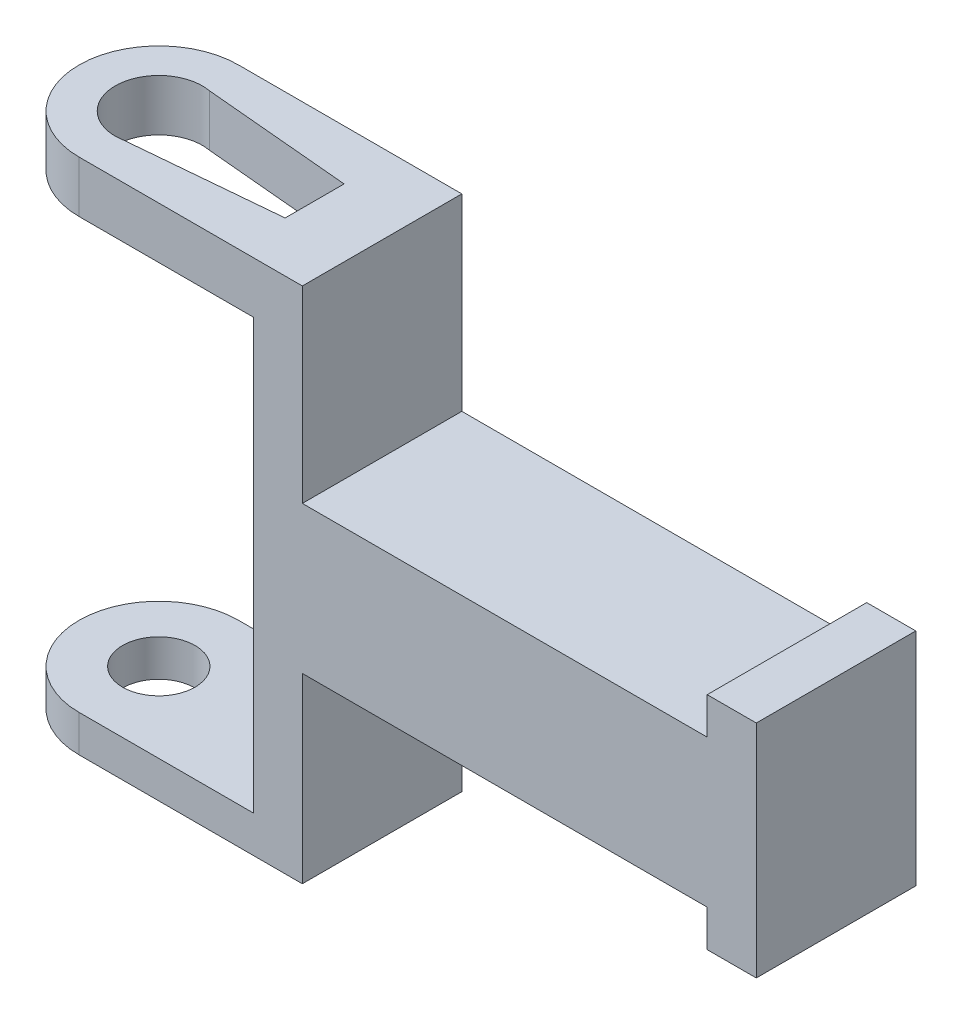
ISO-10303-21;
HEADER;
FILE_DESCRIPTION(('STEP AP214'),'2;1');
FILE_NAME('part.step','',(''),(''),'','','');
FILE_SCHEMA(('AUTOMOTIVE_DESIGN { 1 0 10303 214 1 1 1 1 }'));
ENDSEC;
DATA;
#1=APPLICATION_CONTEXT('core data for automotive mechanical design processes');
#2=APPLICATION_PROTOCOL_DEFINITION('international standard','automotive_design',2000,#1);
#3=PRODUCT_CONTEXT('',#1,'mechanical');
#4=PRODUCT('Part','Part','',(#3));
#5=PRODUCT_RELATED_PRODUCT_CATEGORY('part','',(#4));
#6=PRODUCT_DEFINITION_FORMATION('','',#4);
#7=PRODUCT_DEFINITION_CONTEXT('part definition',#1,'design');
#8=PRODUCT_DEFINITION('design','',#6,#7);
#9=PRODUCT_DEFINITION_SHAPE('','',#8);
#10=(LENGTH_UNIT() NAMED_UNIT(*) SI_UNIT(.MILLI.,.METRE.));
#11=(NAMED_UNIT(*) PLANE_ANGLE_UNIT() SI_UNIT($,.RADIAN.));
#12=(NAMED_UNIT(*) SI_UNIT($,.STERADIAN.) SOLID_ANGLE_UNIT());
#13=UNCERTAINTY_MEASURE_WITH_UNIT(LENGTH_MEASURE(1.E-05),#10,'distance_accuracy_value','');
#14=(GEOMETRIC_REPRESENTATION_CONTEXT(3) GLOBAL_UNCERTAINTY_ASSIGNED_CONTEXT((#13)) GLOBAL_UNIT_ASSIGNED_CONTEXT((#10,
#11,#12)) REPRESENTATION_CONTEXT('',''));
#15=CARTESIAN_POINT('',(0.,0.,0.));
#16=DIRECTION('',(0.,0.,1.));
#17=DIRECTION('',(1.,0.,0.));
#18=AXIS2_PLACEMENT_3D('',#15,#16,#17);
#19=CARTESIAN_POINT('',(-1.,0.,0.));
#20=DIRECTION('',(-1.,0.,0.));
#21=DIRECTION('',(0.,0.,1.));
#22=AXIS2_PLACEMENT_3D('',#19,#20,#21);
#23=PLANE('',#22);
#24=DIRECTION('',(0.,0.,-1.));
#25=VECTOR('',#24,1.);
#26=CARTESIAN_POINT('',(-1.,62.,0.));
#27=LINE('',#26,#25);
#28=CARTESIAN_POINT('',(-1.,62.,6.5));
#29=VERTEX_POINT('',#28);
#30=CARTESIAN_POINT('',(-1.,62.,-6.5));
#31=VERTEX_POINT('',#30);
#32=EDGE_CURVE('E48',#29,#31,#27,.T.);
#33=ORIENTED_EDGE('',*,*,#32,.F.);
#34=DIRECTION('',(0.,-1.,0.));
#35=VECTOR('',#34,1.);
#36=CARTESIAN_POINT('',(-1.,47.15,6.5));
#37=LINE('',#36,#35);
#38=CARTESIAN_POINT('',(-1.,47.15,6.5));
#39=VERTEX_POINT('',#38);
#40=EDGE_CURVE('E319',#29,#39,#37,.T.);
#41=ORIENTED_EDGE('',*,*,#40,.T.);
#42=DIRECTION('',(0.,0.,-1.));
#43=VECTOR('',#42,1.);
#44=CARTESIAN_POINT('',(-1.,47.15,6.5));
#45=LINE('',#44,#43);
#46=CARTESIAN_POINT('',(-1.,47.15,-6.5));
#47=VERTEX_POINT('',#46);
#48=EDGE_CURVE('E318',#39,#47,#45,.T.);
#49=ORIENTED_EDGE('',*,*,#48,.T.);
#50=DIRECTION('',(0.,1.,0.));
#51=VECTOR('',#50,1.);
#52=CARTESIAN_POINT('',(-1.,47.15,-6.5));
#53=LINE('',#52,#51);
#54=EDGE_CURVE('E323',#47,#31,#53,.T.);
#55=ORIENTED_EDGE('',*,*,#54,.T.);
#56=EDGE_LOOP('',(#33,#41,#49,#55));
#57=FACE_BOUND('',#56,.T.);
#58=ADVANCED_FACE('F39',(#57),#23,.F.);
#59=DIRECTION('',(0.,0.,1.));
#60=VECTOR('',#59,1.);
#61=CARTESIAN_POINT('',(-1.,74.,0.));
#62=LINE('',#61,#60);
#63=CARTESIAN_POINT('',(-1.,74.,-6.5));
#64=VERTEX_POINT('',#63);
#65=CARTESIAN_POINT('',(-1.,74.,6.5));
#66=VERTEX_POINT('',#65);
#67=EDGE_CURVE('E365',#64,#66,#62,.T.);
#68=ORIENTED_EDGE('',*,*,#67,.F.);
#69=CARTESIAN_POINT('',(-1.,89.35,-6.5));
#70=VERTEX_POINT('',#69);
#71=EDGE_CURVE('E322',#64,#70,#53,.T.);
#72=ORIENTED_EDGE('',*,*,#71,.T.);
#73=DIRECTION('',(0.,0.,1.));
#74=VECTOR('',#73,1.);
#75=CARTESIAN_POINT('',(-1.,89.35,6.5));
#76=LINE('',#75,#74);
#77=CARTESIAN_POINT('',(-1.,89.35,6.5));
#78=VERTEX_POINT('',#77);
#79=EDGE_CURVE('E327',#70,#78,#76,.T.);
#80=ORIENTED_EDGE('',*,*,#79,.T.);
#81=EDGE_CURVE('E314',#78,#66,#37,.T.);
#82=ORIENTED_EDGE('',*,*,#81,.T.);
#83=EDGE_LOOP('',(#68,#72,#80,#82));
#84=FACE_BOUND('',#83,.T.);
#85=ADVANCED_FACE('F385',(#84),#23,.F.);
#86=CARTESIAN_POINT('',(-5.,0.,0.));
#87=DIRECTION('',(-1.,0.,0.));
#88=DIRECTION('',(0.,0.,1.));
#89=AXIS2_PLACEMENT_3D('',#86,#87,#88);
#90=PLANE('',#89);
#91=DIRECTION('',(0.,1.,0.));
#92=VECTOR('',#91,1.);
#93=CARTESIAN_POINT('',(-5.,47.15,-6.5));
#94=LINE('',#93,#92);
#95=CARTESIAN_POINT('',(-5.,50.15,-6.5));
#96=VERTEX_POINT('',#95);
#97=CARTESIAN_POINT('',(-5.,85.15,-6.5));
#98=VERTEX_POINT('',#97);
#99=EDGE_CURVE('E334',#96,#98,#94,.T.);
#100=ORIENTED_EDGE('',*,*,#99,.F.);
#101=DIRECTION('',(0.,0.,1.));
#102=VECTOR('',#101,1.);
#103=CARTESIAN_POINT('',(-5.,50.15,0.));
#104=LINE('',#103,#102);
#105=CARTESIAN_POINT('',(-5.,50.15,6.5));
#106=VERTEX_POINT('',#105);
#107=EDGE_CURVE('E361',#96,#106,#104,.T.);
#108=ORIENTED_EDGE('',*,*,#107,.T.);
#109=DIRECTION('',(0.,-1.,0.));
#110=VECTOR('',#109,1.);
#111=CARTESIAN_POINT('',(-5.,47.15,6.5));
#112=LINE('',#111,#110);
#113=CARTESIAN_POINT('',(-5.,85.15,6.5));
#114=VERTEX_POINT('',#113);
#115=EDGE_CURVE('E313',#114,#106,#112,.T.);
#116=ORIENTED_EDGE('',*,*,#115,.F.);
#117=DIRECTION('',(0.,0.,1.));
#118=VECTOR('',#117,1.);
#119=CARTESIAN_POINT('',(-5.,85.15,0.));
#120=LINE('',#119,#118);
#121=EDGE_CURVE('E349',#98,#114,#120,.T.);
#122=ORIENTED_EDGE('',*,*,#121,.F.);
#123=EDGE_LOOP('',(#100,#108,#116,#122));
#124=FACE_BOUND('',#123,.T.);
#125=ADVANCED_FACE('F441',(#124),#90,.T.);
#126=CARTESIAN_POINT('',(-1.,47.15,6.5));
#127=DIRECTION('',(0.,0.,-1.));
#128=DIRECTION('',(-1.,0.,0.));
#129=AXIS2_PLACEMENT_3D('',#126,#127,#128);
#130=PLANE('',#129);
#131=DIRECTION('',(-1.,0.,0.));
#132=VECTOR('',#131,1.);
#133=CARTESIAN_POINT('',(36.,62.,6.5));
#134=LINE('',#133,#132);
#135=CARTESIAN_POINT('',(32.,62.,6.5));
#136=VERTEX_POINT('',#135);
#137=EDGE_CURVE('E221',#136,#29,#134,.T.);
#138=ORIENTED_EDGE('',*,*,#137,.F.);
#139=DIRECTION('',(0.,-1.,0.));
#140=VECTOR('',#139,1.);
#141=CARTESIAN_POINT('',(32.,59.,6.5));
#142=LINE('',#141,#140);
#143=CARTESIAN_POINT('',(32.,59.,6.5));
#144=VERTEX_POINT('',#143);
#145=EDGE_CURVE('E55',#136,#144,#142,.T.);
#146=ORIENTED_EDGE('',*,*,#145,.T.);
#147=DIRECTION('',(-1.,0.,0.));
#148=VECTOR('',#147,1.);
#149=CARTESIAN_POINT('',(36.,59.,6.5));
#150=LINE('',#149,#148);
#151=CARTESIAN_POINT('',(36.,59.,6.5));
#152=VERTEX_POINT('',#151);
#153=EDGE_CURVE('E194',#152,#144,#150,.T.);
#154=ORIENTED_EDGE('',*,*,#153,.F.);
#155=DIRECTION('',(0.,-1.,0.));
#156=VECTOR('',#155,1.);
#157=CARTESIAN_POINT('',(36.,62.,6.5));
#158=LINE('',#157,#156);
#159=CARTESIAN_POINT('',(36.,77.,6.5));
#160=VERTEX_POINT('',#159);
#161=EDGE_CURVE('E176',#160,#152,#158,.T.);
#162=ORIENTED_EDGE('',*,*,#161,.F.);
#163=DIRECTION('',(-1.,0.,0.));
#164=VECTOR('',#163,1.);
#165=CARTESIAN_POINT('',(36.,77.,6.5));
#166=LINE('',#165,#164);
#167=CARTESIAN_POINT('',(32.,77.,6.5));
#168=VERTEX_POINT('',#167);
#169=EDGE_CURVE('E410',#160,#168,#166,.T.);
#170=ORIENTED_EDGE('',*,*,#169,.T.);
#171=CARTESIAN_POINT('',(32.,74.,6.5));
#172=VERTEX_POINT('',#171);
#173=EDGE_CURVE('E413',#168,#172,#142,.T.);
#174=ORIENTED_EDGE('',*,*,#173,.T.);
#175=DIRECTION('',(-1.,0.,0.));
#176=VECTOR('',#175,1.);
#177=CARTESIAN_POINT('',(36.,74.,6.5));
#178=LINE('',#177,#176);
#179=EDGE_CURVE('E212',#172,#66,#178,.T.);
#180=ORIENTED_EDGE('',*,*,#179,.T.);
#181=ORIENTED_EDGE('',*,*,#81,.F.);
#182=DIRECTION('',(-1.,0.,0.));
#183=VECTOR('',#182,1.);
#184=CARTESIAN_POINT('',(-1.,89.35,6.5));
#185=LINE('',#184,#183);
#186=CARTESIAN_POINT('',(-19.2,89.35,6.5));
#187=VERTEX_POINT('',#186);
#188=EDGE_CURVE('E330',#78,#187,#185,.T.);
#189=ORIENTED_EDGE('',*,*,#188,.T.);
#190=DIRECTION('',(0.,-1.,0.));
#191=VECTOR('',#190,1.);
#192=CARTESIAN_POINT('',(-19.2,89.35,6.5));
#193=LINE('',#192,#191);
#194=CARTESIAN_POINT('',(-19.2,85.15,6.5));
#195=VERTEX_POINT('',#194);
#196=EDGE_CURVE('E310',#187,#195,#193,.T.);
#197=ORIENTED_EDGE('',*,*,#196,.T.);
#198=DIRECTION('',(1.,0.,0.));
#199=VECTOR('',#198,1.);
#200=CARTESIAN_POINT('',(-19.2,85.15,6.5));
#201=LINE('',#200,#199);
#202=EDGE_CURVE('E296',#195,#114,#201,.T.);
#203=ORIENTED_EDGE('',*,*,#202,.T.);
#204=ORIENTED_EDGE('',*,*,#115,.T.);
#205=DIRECTION('',(1.,0.,0.));
#206=VECTOR('',#205,1.);
#207=CARTESIAN_POINT('',(-19.2,50.15,6.5));
#208=LINE('',#207,#206);
#209=CARTESIAN_POINT('',(-19.2,50.15,6.5));
#210=VERTEX_POINT('',#209);
#211=EDGE_CURVE('E237',#210,#106,#208,.T.);
#212=ORIENTED_EDGE('',*,*,#211,.F.);
#213=DIRECTION('',(0.,-1.,0.));
#214=VECTOR('',#213,1.);
#215=CARTESIAN_POINT('',(-19.2,50.15,6.5));
#216=LINE('',#215,#214);
#217=CARTESIAN_POINT('',(-19.2,47.15,6.5));
#218=VERTEX_POINT('',#217);
#219=EDGE_CURVE('E250',#210,#218,#216,.T.);
#220=ORIENTED_EDGE('',*,*,#219,.T.);
#221=DIRECTION('',(-1.,0.,0.));
#222=VECTOR('',#221,1.);
#223=CARTESIAN_POINT('',(-1.,47.15,6.5));
#224=LINE('',#223,#222);
#225=EDGE_CURVE('E345',#39,#218,#224,.T.);
#226=ORIENTED_EDGE('',*,*,#225,.F.);
#227=ORIENTED_EDGE('',*,*,#40,.F.);
#228=EDGE_LOOP('',(#138,#146,#154,#162,#170,#174,#180,#181,#189,#197,#203,#204,#212,#220,#226,#227));
#229=FACE_BOUND('',#228,.T.);
#230=ADVANCED_FACE('F41',(#229),#130,.F.);
#231=CARTESIAN_POINT('',(-1.,47.15,6.5));
#232=DIRECTION('',(0.,1.,0.));
#233=DIRECTION('',(0.,0.,1.));
#234=AXIS2_PLACEMENT_3D('',#231,#232,#233);
#235=PLANE('',#234);
#236=CARTESIAN_POINT('',(-19.2,47.15,0.));
#237=DIRECTION('',(0.,1.,0.));
#238=DIRECTION('',(0.,0.,1.));
#239=AXIS2_PLACEMENT_3D('',#236,#237,#238);
#240=CIRCLE('',#239,2.95);
#241=CARTESIAN_POINT('',(-19.2,47.15,2.95));
#242=VERTEX_POINT('',#241);
#243=EDGE_CURVE('E225',#242,#242,#240,.T.);
#244=ORIENTED_EDGE('',*,*,#243,.T.);
#245=EDGE_LOOP('',(#244));
#246=FACE_BOUND('',#245,.T.);
#247=ORIENTED_EDGE('',*,*,#225,.T.);
#248=CARTESIAN_POINT('',(-19.2,47.15,0.));
#249=DIRECTION('',(0.,1.,0.));
#250=DIRECTION('',(0.,0.,1.));
#251=AXIS2_PLACEMENT_3D('',#248,#249,#250);
#252=CIRCLE('',#251,6.5);
#253=CARTESIAN_POINT('',(-19.2,47.15,-6.5));
#254=VERTEX_POINT('',#253);
#255=EDGE_CURVE('E229',#254,#218,#252,.T.);
#256=ORIENTED_EDGE('',*,*,#255,.F.);
#257=DIRECTION('',(-1.,0.,0.));
#258=VECTOR('',#257,1.);
#259=CARTESIAN_POINT('',(-1.,47.15,-6.5));
#260=LINE('',#259,#258);
#261=EDGE_CURVE('E342',#47,#254,#260,.T.);
#262=ORIENTED_EDGE('',*,*,#261,.F.);
#263=ORIENTED_EDGE('',*,*,#48,.F.);
#264=EDGE_LOOP('',(#247,#256,#262,#263));
#265=FACE_BOUND('',#264,.T.);
#266=ADVANCED_FACE('F453',(#246,#265),#235,.F.);
#267=CARTESIAN_POINT('',(-1.,47.15,-6.5));
#268=DIRECTION('',(0.,0.,1.));
#269=DIRECTION('',(1.,0.,0.));
#270=AXIS2_PLACEMENT_3D('',#267,#268,#269);
#271=PLANE('',#270);
#272=DIRECTION('',(-1.,0.,0.));
#273=VECTOR('',#272,1.);
#274=CARTESIAN_POINT('',(36.,74.,-6.5));
#275=LINE('',#274,#273);
#276=CARTESIAN_POINT('',(32.,74.,-6.5));
#277=VERTEX_POINT('',#276);
#278=EDGE_CURVE('E215',#277,#64,#275,.T.);
#279=ORIENTED_EDGE('',*,*,#278,.F.);
#280=DIRECTION('',(0.,1.,0.));
#281=VECTOR('',#280,1.);
#282=CARTESIAN_POINT('',(32.,59.,-6.5));
#283=LINE('',#282,#281);
#284=CARTESIAN_POINT('',(32.,77.,-6.5));
#285=VERTEX_POINT('',#284);
#286=EDGE_CURVE('E63',#277,#285,#283,.T.);
#287=ORIENTED_EDGE('',*,*,#286,.T.);
#288=DIRECTION('',(-1.,0.,0.));
#289=VECTOR('',#288,1.);
#290=CARTESIAN_POINT('',(36.,77.,-6.5));
#291=LINE('',#290,#289);
#292=CARTESIAN_POINT('',(36.,77.,-6.5));
#293=VERTEX_POINT('',#292);
#294=EDGE_CURVE('E206',#293,#285,#291,.T.);
#295=ORIENTED_EDGE('',*,*,#294,.F.);
#296=DIRECTION('',(0.,1.,0.));
#297=VECTOR('',#296,1.);
#298=CARTESIAN_POINT('',(36.,62.,-6.5));
#299=LINE('',#298,#297);
#300=CARTESIAN_POINT('',(36.,59.,-6.5));
#301=VERTEX_POINT('',#300);
#302=EDGE_CURVE('E188',#301,#293,#299,.T.);
#303=ORIENTED_EDGE('',*,*,#302,.F.);
#304=DIRECTION('',(-1.,0.,0.));
#305=VECTOR('',#304,1.);
#306=CARTESIAN_POINT('',(36.,59.,-6.5));
#307=LINE('',#306,#305);
#308=CARTESIAN_POINT('',(32.,59.,-6.5));
#309=VERTEX_POINT('',#308);
#310=EDGE_CURVE('E196',#301,#309,#307,.T.);
#311=ORIENTED_EDGE('',*,*,#310,.T.);
#312=CARTESIAN_POINT('',(32.,62.,-6.5));
#313=VERTEX_POINT('',#312);
#314=EDGE_CURVE('E404',#309,#313,#283,.T.);
#315=ORIENTED_EDGE('',*,*,#314,.T.);
#316=DIRECTION('',(-1.,0.,0.));
#317=VECTOR('',#316,1.);
#318=CARTESIAN_POINT('',(36.,62.,-6.5));
#319=LINE('',#318,#317);
#320=EDGE_CURVE('E218',#313,#31,#319,.T.);
#321=ORIENTED_EDGE('',*,*,#320,.T.);
#322=ORIENTED_EDGE('',*,*,#54,.F.);
#323=ORIENTED_EDGE('',*,*,#261,.T.);
#324=DIRECTION('',(0.,-1.,0.));
#325=VECTOR('',#324,1.);
#326=CARTESIAN_POINT('',(-19.2,50.15,-6.5));
#327=LINE('',#326,#325);
#328=CARTESIAN_POINT('',(-19.2,50.15,-6.5));
#329=VERTEX_POINT('',#328);
#330=EDGE_CURVE('E246',#329,#254,#327,.T.);
#331=ORIENTED_EDGE('',*,*,#330,.F.);
#332=DIRECTION('',(-1.,0.,0.));
#333=VECTOR('',#332,1.);
#334=CARTESIAN_POINT('',(-19.2,50.15,-6.5));
#335=LINE('',#334,#333);
#336=EDGE_CURVE('E243',#96,#329,#335,.T.);
#337=ORIENTED_EDGE('',*,*,#336,.F.);
#338=ORIENTED_EDGE('',*,*,#99,.T.);
#339=DIRECTION('',(-1.,0.,0.));
#340=VECTOR('',#339,1.);
#341=CARTESIAN_POINT('',(-19.2,85.15,-6.5));
#342=LINE('',#341,#340);
#343=CARTESIAN_POINT('',(-19.2,85.15,-6.5));
#344=VERTEX_POINT('',#343);
#345=EDGE_CURVE('E303',#98,#344,#342,.T.);
#346=ORIENTED_EDGE('',*,*,#345,.T.);
#347=DIRECTION('',(0.,-1.,0.));
#348=VECTOR('',#347,1.);
#349=CARTESIAN_POINT('',(-19.2,89.35,-6.5));
#350=LINE('',#349,#348);
#351=CARTESIAN_POINT('',(-19.2,89.35,-6.5));
#352=VERTEX_POINT('',#351);
#353=EDGE_CURVE('E306',#352,#344,#350,.T.);
#354=ORIENTED_EDGE('',*,*,#353,.F.);
#355=DIRECTION('',(-1.,0.,0.));
#356=VECTOR('',#355,1.);
#357=CARTESIAN_POINT('',(-1.,89.35,-6.5));
#358=LINE('',#357,#356);
#359=EDGE_CURVE('E339',#70,#352,#358,.T.);
#360=ORIENTED_EDGE('',*,*,#359,.F.);
#361=ORIENTED_EDGE('',*,*,#71,.F.);
#362=EDGE_LOOP('',(#279,#287,#295,#303,#311,#315,#321,#322,#323,#331,#337,#338,#346,#354,#360,#361));
#363=FACE_BOUND('',#362,.T.);
#364=ADVANCED_FACE('F391',(#363),#271,.F.);
#365=CARTESIAN_POINT('',(-1.,89.35,6.5));
#366=DIRECTION('',(0.,-1.,0.));
#367=DIRECTION('',(0.,0.,-1.));
#368=AXIS2_PLACEMENT_3D('',#365,#366,#367);
#369=PLANE('',#368);
#370=CARTESIAN_POINT('',(-19.2,89.35,0.));
#371=DIRECTION('',(0.,1.,0.));
#372=DIRECTION('',(0.,0.,1.));
#373=AXIS2_PLACEMENT_3D('',#370,#371,#372);
#374=CIRCLE('',#373,3.55);
#375=CARTESIAN_POINT('',(-18.5641054158038,89.35,-3.49258329575545));
#376=VERTEX_POINT('',#375);
#377=CARTESIAN_POINT('',(-18.5641054158038,89.35,3.49258329575545));
#378=VERTEX_POINT('',#377);
#379=EDGE_CURVE('E280',#376,#378,#374,.T.);
#380=ORIENTED_EDGE('',*,*,#379,.F.);
#381=DIRECTION('',(-0.995948362239352,0.,-0.0899269689956986));
#382=VECTOR('',#381,1.);
#383=CARTESIAN_POINT('',(-6.5,89.35,-2.40328140539589));
#384=LINE('',#383,#382);
#385=CARTESIAN_POINT('',(-6.5,89.35,-2.40328140539589));
#386=VERTEX_POINT('',#385);
#387=EDGE_CURVE('E259',#386,#376,#384,.T.);
#388=ORIENTED_EDGE('',*,*,#387,.F.);
#389=DIRECTION('',(0.,0.,-1.));
#390=VECTOR('',#389,1.);
#391=CARTESIAN_POINT('',(-6.5,89.35,2.40328140539589));
#392=LINE('',#391,#390);
#393=CARTESIAN_POINT('',(-6.5,89.35,2.40328140539589));
#394=VERTEX_POINT('',#393);
#395=EDGE_CURVE('E270',#394,#386,#392,.T.);
#396=ORIENTED_EDGE('',*,*,#395,.F.);
#397=DIRECTION('',(0.995948362239352,0.,-0.0899269689956986));
#398=VECTOR('',#397,1.);
#399=CARTESIAN_POINT('',(-19.2,89.35,3.55));
#400=LINE('',#399,#398);
#401=EDGE_CURVE('E253',#378,#394,#400,.T.);
#402=ORIENTED_EDGE('',*,*,#401,.F.);
#403=EDGE_LOOP('',(#380,#388,#396,#402));
#404=FACE_BOUND('',#403,.T.);
#405=ORIENTED_EDGE('',*,*,#359,.T.);
#406=CARTESIAN_POINT('',(-19.2,89.35,0.));
#407=DIRECTION('',(0.,1.,0.));
#408=DIRECTION('',(0.,0.,1.));
#409=AXIS2_PLACEMENT_3D('',#406,#407,#408);
#410=CIRCLE('',#409,6.5);
#411=EDGE_CURVE('E292',#352,#187,#410,.T.);
#412=ORIENTED_EDGE('',*,*,#411,.T.);
#413=ORIENTED_EDGE('',*,*,#188,.F.);
#414=ORIENTED_EDGE('',*,*,#79,.F.);
#415=EDGE_LOOP('',(#405,#412,#413,#414));
#416=FACE_BOUND('',#415,.T.);
#417=ADVANCED_FACE('F394',(#404,#416),#369,.F.);
#418=CARTESIAN_POINT('',(0.,85.15,0.));
#419=DIRECTION('',(0.,-1.,0.));
#420=DIRECTION('',(0.,0.,-1.));
#421=AXIS2_PLACEMENT_3D('',#418,#419,#420);
#422=PLANE('',#421);
#423=DIRECTION('',(-0.995948362239352,0.,-0.0899269689956986));
#424=VECTOR('',#423,1.);
#425=CARTESIAN_POINT('',(-6.5,85.15,-2.40328140539589));
#426=LINE('',#425,#424);
#427=CARTESIAN_POINT('',(-6.5,85.15,-2.40328140539589));
#428=VERTEX_POINT('',#427);
#429=CARTESIAN_POINT('',(-18.5641054158038,85.15,-3.49258329575545));
#430=VERTEX_POINT('',#429);
#431=EDGE_CURVE('E263',#428,#430,#426,.T.);
#432=ORIENTED_EDGE('',*,*,#431,.T.);
#433=CARTESIAN_POINT('',(-19.2,85.15,0.));
#434=DIRECTION('',(0.,1.,0.));
#435=DIRECTION('',(0.,0.,1.));
#436=AXIS2_PLACEMENT_3D('',#433,#434,#435);
#437=CIRCLE('',#436,3.55);
#438=CARTESIAN_POINT('',(-18.5641054158038,85.15,3.49258329575545));
#439=VERTEX_POINT('',#438);
#440=EDGE_CURVE('E284',#430,#439,#437,.T.);
#441=ORIENTED_EDGE('',*,*,#440,.T.);
#442=DIRECTION('',(0.995948362239352,0.,-0.0899269689956986));
#443=VECTOR('',#442,1.);
#444=CARTESIAN_POINT('',(-19.2,85.15,3.55));
#445=LINE('',#444,#443);
#446=CARTESIAN_POINT('',(-6.5,85.15,2.40328140539589));
#447=VERTEX_POINT('',#446);
#448=EDGE_CURVE('E254',#439,#447,#445,.T.);
#449=ORIENTED_EDGE('',*,*,#448,.T.);
#450=DIRECTION('',(0.,0.,-1.));
#451=VECTOR('',#450,1.);
#452=CARTESIAN_POINT('',(-6.5,85.15,2.40328140539589));
#453=LINE('',#452,#451);
#454=EDGE_CURVE('E258',#447,#428,#453,.T.);
#455=ORIENTED_EDGE('',*,*,#454,.T.);
#456=EDGE_LOOP('',(#432,#441,#449,#455));
#457=FACE_BOUND('',#456,.T.);
#458=ORIENTED_EDGE('',*,*,#202,.F.);
#459=CARTESIAN_POINT('',(-19.2,85.15,0.));
#460=DIRECTION('',(0.,1.,0.));
#461=DIRECTION('',(0.,0.,1.));
#462=AXIS2_PLACEMENT_3D('',#459,#460,#461);
#463=CIRCLE('',#462,6.5);
#464=EDGE_CURVE('E288',#344,#195,#463,.T.);
#465=ORIENTED_EDGE('',*,*,#464,.F.);
#466=ORIENTED_EDGE('',*,*,#345,.F.);
#467=ORIENTED_EDGE('',*,*,#121,.T.);
#468=EDGE_LOOP('',(#458,#465,#466,#467));
#469=FACE_BOUND('',#468,.T.);
#470=ADVANCED_FACE('F444',(#457,#469),#422,.T.);
#471=CARTESIAN_POINT('',(-19.2,89.35,0.));
#472=DIRECTION('',(0.,-1.,0.));
#473=DIRECTION('',(0.,0.,-1.));
#474=AXIS2_PLACEMENT_3D('',#471,#472,#473);
#475=CYLINDRICAL_SURFACE('',#474,6.5);
#476=ORIENTED_EDGE('',*,*,#464,.T.);
#477=ORIENTED_EDGE('',*,*,#196,.F.);
#478=ORIENTED_EDGE('',*,*,#411,.F.);
#479=ORIENTED_EDGE('',*,*,#353,.T.);
#480=EDGE_LOOP('',(#476,#477,#478,#479));
#481=FACE_BOUND('',#480,.T.);
#482=ADVANCED_FACE('F477',(#481),#475,.T.);
#483=CARTESIAN_POINT('',(-19.2,85.15,0.));
#484=DIRECTION('',(0.,1.,0.));
#485=DIRECTION('',(0.,0.,1.));
#486=AXIS2_PLACEMENT_3D('',#483,#484,#485);
#487=CYLINDRICAL_SURFACE('',#486,3.55);
#488=ORIENTED_EDGE('',*,*,#379,.T.);
#489=DIRECTION('',(0.,1.,0.));
#490=VECTOR('',#489,1.);
#491=CARTESIAN_POINT('',(-18.5641054158038,85.15,3.49258329575545));
#492=LINE('',#491,#490);
#493=EDGE_CURVE('E353',#378,#439,#492,.F.);
#494=ORIENTED_EDGE('',*,*,#493,.T.);
#495=ORIENTED_EDGE('',*,*,#440,.F.);
#496=DIRECTION('',(0.,1.,0.));
#497=VECTOR('',#496,1.);
#498=CARTESIAN_POINT('',(-18.5641054158038,85.15,-3.49258329575545));
#499=LINE('',#498,#497);
#500=EDGE_CURVE('E357',#430,#376,#499,.T.);
#501=ORIENTED_EDGE('',*,*,#500,.T.);
#502=EDGE_LOOP('',(#488,#494,#495,#501));
#503=FACE_BOUND('',#502,.T.);
#504=ADVANCED_FACE('F497',(#503),#487,.F.);
#505=CARTESIAN_POINT('',(-6.5,85.15,-2.40328140539589));
#506=DIRECTION('',(0.0899269689956986,0.,-0.995948362239351));
#507=DIRECTION('',(-0.995948362239352,0.,-0.0899269689956986));
#508=AXIS2_PLACEMENT_3D('',#505,#506,#507);
#509=PLANE('',#508);
#510=ORIENTED_EDGE('',*,*,#431,.F.);
#511=DIRECTION('',(0.,1.,0.));
#512=VECTOR('',#511,1.);
#513=CARTESIAN_POINT('',(-6.5,85.15,-2.40328140539589));
#514=LINE('',#513,#512);
#515=EDGE_CURVE('E277',#428,#386,#514,.T.);
#516=ORIENTED_EDGE('',*,*,#515,.T.);
#517=ORIENTED_EDGE('',*,*,#387,.T.);
#518=ORIENTED_EDGE('',*,*,#500,.F.);
#519=EDGE_LOOP('',(#510,#516,#517,#518));
#520=FACE_BOUND('',#519,.T.);
#521=ADVANCED_FACE('F495',(#520),#509,.F.);
#522=CARTESIAN_POINT('',(-19.2,85.15,3.55));
#523=DIRECTION('',(0.0899269689956986,0.,0.995948362239351));
#524=DIRECTION('',(0.995948362239352,0.,-0.0899269689956986));
#525=AXIS2_PLACEMENT_3D('',#522,#523,#524);
#526=PLANE('',#525);
#527=ORIENTED_EDGE('',*,*,#401,.T.);
#528=DIRECTION('',(0.,1.,0.));
#529=VECTOR('',#528,1.);
#530=CARTESIAN_POINT('',(-6.5,85.15,2.40328140539589));
#531=LINE('',#530,#529);
#532=EDGE_CURVE('E267',#447,#394,#531,.T.);
#533=ORIENTED_EDGE('',*,*,#532,.F.);
#534=ORIENTED_EDGE('',*,*,#448,.F.);
#535=ORIENTED_EDGE('',*,*,#493,.F.);
#536=EDGE_LOOP('',(#527,#533,#534,#535));
#537=FACE_BOUND('',#536,.T.);
#538=ADVANCED_FACE('F489',(#537),#526,.F.);
#539=CARTESIAN_POINT('',(-6.5,85.15,2.40328140539589));
#540=DIRECTION('',(1.,0.,0.));
#541=DIRECTION('',(0.,0.,-1.));
#542=AXIS2_PLACEMENT_3D('',#539,#540,#541);
#543=PLANE('',#542);
#544=ORIENTED_EDGE('',*,*,#395,.T.);
#545=ORIENTED_EDGE('',*,*,#515,.F.);
#546=ORIENTED_EDGE('',*,*,#454,.F.);
#547=ORIENTED_EDGE('',*,*,#532,.T.);
#548=EDGE_LOOP('',(#544,#545,#546,#547));
#549=FACE_BOUND('',#548,.T.);
#550=ADVANCED_FACE('F480',(#549),#543,.F.);
#551=CARTESIAN_POINT('',(0.,50.15,0.));
#552=DIRECTION('',(0.,-1.,0.));
#553=DIRECTION('',(0.,0.,-1.));
#554=AXIS2_PLACEMENT_3D('',#551,#552,#553);
#555=PLANE('',#554);
#556=CARTESIAN_POINT('',(-19.2,50.15,0.));
#557=DIRECTION('',(0.,1.,0.));
#558=DIRECTION('',(0.,0.,1.));
#559=AXIS2_PLACEMENT_3D('',#556,#557,#558);
#560=CIRCLE('',#559,2.95);
#561=CARTESIAN_POINT('',(-19.2,50.15,2.95));
#562=VERTEX_POINT('',#561);
#563=EDGE_CURVE('E224',#562,#562,#560,.T.);
#564=ORIENTED_EDGE('',*,*,#563,.F.);
#565=EDGE_LOOP('',(#564));
#566=FACE_BOUND('',#565,.T.);
#567=ORIENTED_EDGE('',*,*,#336,.T.);
#568=CARTESIAN_POINT('',(-19.2,50.15,0.));
#569=DIRECTION('',(0.,1.,0.));
#570=DIRECTION('',(0.,0.,1.));
#571=AXIS2_PLACEMENT_3D('',#568,#569,#570);
#572=CIRCLE('',#571,6.5);
#573=EDGE_CURVE('E233',#329,#210,#572,.T.);
#574=ORIENTED_EDGE('',*,*,#573,.T.);
#575=ORIENTED_EDGE('',*,*,#211,.T.);
#576=ORIENTED_EDGE('',*,*,#107,.F.);
#577=EDGE_LOOP('',(#567,#574,#575,#576));
#578=FACE_BOUND('',#577,.T.);
#579=ADVANCED_FACE('F478',(#566,#578),#555,.F.);
#580=CARTESIAN_POINT('',(-19.2,50.15,0.));
#581=DIRECTION('',(0.,-1.,0.));
#582=DIRECTION('',(0.,0.,-1.));
#583=AXIS2_PLACEMENT_3D('',#580,#581,#582);
#584=CYLINDRICAL_SURFACE('',#583,6.5);
#585=ORIENTED_EDGE('',*,*,#255,.T.);
#586=ORIENTED_EDGE('',*,*,#219,.F.);
#587=ORIENTED_EDGE('',*,*,#573,.F.);
#588=ORIENTED_EDGE('',*,*,#330,.T.);
#589=EDGE_LOOP('',(#585,#586,#587,#588));
#590=FACE_BOUND('',#589,.T.);
#591=ADVANCED_FACE('F465',(#590),#584,.T.);
#592=CARTESIAN_POINT('',(-19.2,47.15,0.));
#593=DIRECTION('',(0.,1.,0.));
#594=DIRECTION('',(0.,0.,1.));
#595=AXIS2_PLACEMENT_3D('',#592,#593,#594);
#596=CYLINDRICAL_SURFACE('',#595,2.95);
#597=ORIENTED_EDGE('',*,*,#243,.F.);
#598=EDGE_LOOP('',(#597));
#599=FACE_BOUND('',#598,.T.);
#600=ORIENTED_EDGE('',*,*,#563,.T.);
#601=EDGE_LOOP('',(#600));
#602=FACE_BOUND('',#601,.T.);
#603=ADVANCED_FACE('F487',(#599,#602),#596,.F.);
#604=CARTESIAN_POINT('',(36.,62.,6.5));
#605=DIRECTION('',(0.,1.,0.));
#606=DIRECTION('',(0.,0.,1.));
#607=AXIS2_PLACEMENT_3D('',#604,#605,#606);
#608=PLANE('',#607);
#609=ORIENTED_EDGE('',*,*,#320,.F.);
#610=DIRECTION('',(0.,0.,1.));
#611=VECTOR('',#610,1.);
#612=CARTESIAN_POINT('',(32.,62.,6.5));
#613=LINE('',#612,#611);
#614=EDGE_CURVE('E189',#313,#136,#613,.T.);
#615=ORIENTED_EDGE('',*,*,#614,.T.);
#616=ORIENTED_EDGE('',*,*,#137,.T.);
#617=ORIENTED_EDGE('',*,*,#32,.T.);
#618=EDGE_LOOP('',(#609,#615,#616,#617));
#619=FACE_BOUND('',#618,.T.);
#620=ADVANCED_FACE('F373',(#619),#608,.F.);
#621=CARTESIAN_POINT('',(36.,74.,6.5));
#622=DIRECTION('',(0.,-1.,0.));
#623=DIRECTION('',(0.,0.,-1.));
#624=AXIS2_PLACEMENT_3D('',#621,#622,#623);
#625=PLANE('',#624);
#626=ORIENTED_EDGE('',*,*,#179,.F.);
#627=DIRECTION('',(0.,0.,-1.));
#628=VECTOR('',#627,1.);
#629=CARTESIAN_POINT('',(32.,74.,6.5));
#630=LINE('',#629,#628);
#631=EDGE_CURVE('E11',#172,#277,#630,.T.);
#632=ORIENTED_EDGE('',*,*,#631,.T.);
#633=ORIENTED_EDGE('',*,*,#278,.T.);
#634=ORIENTED_EDGE('',*,*,#67,.T.);
#635=EDGE_LOOP('',(#626,#632,#633,#634));
#636=FACE_BOUND('',#635,.T.);
#637=ADVANCED_FACE('F400',(#636),#625,.F.);
#638=CARTESIAN_POINT('',(36.,0.,0.));
#639=DIRECTION('',(-1.,0.,0.));
#640=DIRECTION('',(0.,0.,1.));
#641=AXIS2_PLACEMENT_3D('',#638,#639,#640);
#642=PLANE('',#641);
#643=ORIENTED_EDGE('',*,*,#161,.T.);
#644=DIRECTION('',(0.,0.,-1.));
#645=VECTOR('',#644,1.);
#646=CARTESIAN_POINT('',(36.,59.,6.5));
#647=LINE('',#646,#645);
#648=EDGE_CURVE('E179',#152,#301,#647,.T.);
#649=ORIENTED_EDGE('',*,*,#648,.T.);
#650=ORIENTED_EDGE('',*,*,#302,.T.);
#651=DIRECTION('',(0.,0.,1.));
#652=VECTOR('',#651,1.);
#653=CARTESIAN_POINT('',(36.,77.,6.5));
#654=LINE('',#653,#652);
#655=EDGE_CURVE('E182',#293,#160,#654,.T.);
#656=ORIENTED_EDGE('',*,*,#655,.T.);
#657=EDGE_LOOP('',(#643,#649,#650,#656));
#658=FACE_BOUND('',#657,.T.);
#659=ADVANCED_FACE('F178',(#658),#642,.F.);
#660=CARTESIAN_POINT('',(36.,77.,6.5));
#661=DIRECTION('',(0.,-1.,0.));
#662=DIRECTION('',(0.,0.,-1.));
#663=AXIS2_PLACEMENT_3D('',#660,#661,#662);
#664=PLANE('',#663);
#665=DIRECTION('',(0.,0.,1.));
#666=VECTOR('',#665,1.);
#667=CARTESIAN_POINT('',(32.,77.,6.5));
#668=LINE('',#667,#666);
#669=EDGE_CURVE('E198',#285,#168,#668,.T.);
#670=ORIENTED_EDGE('',*,*,#669,.T.);
#671=ORIENTED_EDGE('',*,*,#169,.F.);
#672=ORIENTED_EDGE('',*,*,#655,.F.);
#673=ORIENTED_EDGE('',*,*,#294,.T.);
#674=EDGE_LOOP('',(#670,#671,#672,#673));
#675=FACE_BOUND('',#674,.T.);
#676=ADVANCED_FACE('F408',(#675),#664,.F.);
#677=CARTESIAN_POINT('',(32.,0.,0.));
#678=DIRECTION('',(-1.,0.,0.));
#679=DIRECTION('',(0.,0.,1.));
#680=AXIS2_PLACEMENT_3D('',#677,#678,#679);
#681=PLANE('',#680);
#682=ORIENTED_EDGE('',*,*,#631,.F.);
#683=ORIENTED_EDGE('',*,*,#173,.F.);
#684=ORIENTED_EDGE('',*,*,#669,.F.);
#685=ORIENTED_EDGE('',*,*,#286,.F.);
#686=EDGE_LOOP('',(#682,#683,#684,#685));
#687=FACE_BOUND('',#686,.T.);
#688=ADVANCED_FACE('F412',(#687),#681,.T.);
#689=ORIENTED_EDGE('',*,*,#614,.F.);
#690=ORIENTED_EDGE('',*,*,#314,.F.);
#691=DIRECTION('',(0.,0.,-1.));
#692=VECTOR('',#691,1.);
#693=CARTESIAN_POINT('',(32.,59.,6.5));
#694=LINE('',#693,#692);
#695=EDGE_CURVE('E405',#144,#309,#694,.T.);
#696=ORIENTED_EDGE('',*,*,#695,.F.);
#697=ORIENTED_EDGE('',*,*,#145,.F.);
#698=EDGE_LOOP('',(#689,#690,#696,#697));
#699=FACE_BOUND('',#698,.T.);
#700=ADVANCED_FACE('F427',(#699),#681,.T.);
#701=CARTESIAN_POINT('',(36.,59.,6.5));
#702=DIRECTION('',(0.,1.,0.));
#703=DIRECTION('',(0.,0.,1.));
#704=AXIS2_PLACEMENT_3D('',#701,#702,#703);
#705=PLANE('',#704);
#706=ORIENTED_EDGE('',*,*,#695,.T.);
#707=ORIENTED_EDGE('',*,*,#310,.F.);
#708=ORIENTED_EDGE('',*,*,#648,.F.);
#709=ORIENTED_EDGE('',*,*,#153,.T.);
#710=EDGE_LOOP('',(#706,#707,#708,#709));
#711=FACE_BOUND('',#710,.T.);
#712=ADVANCED_FACE('F193',(#711),#705,.F.);
#713=CLOSED_SHELL('',(#58,#85,#125,#230,#266,#364,#417,#470,#482,#504,#521,#538,#550,#579,#591,
#603,#620,#637,#659,#676,#688,#700,#712));
#714=MANIFOLD_SOLID_BREP('B2',#713);
#715=ADVANCED_BREP_SHAPE_REPRESENTATION('',(#18,#714),#14);
#716=SHAPE_DEFINITION_REPRESENTATION(#9,#715);
ENDSEC;
END-ISO-10303-21;
